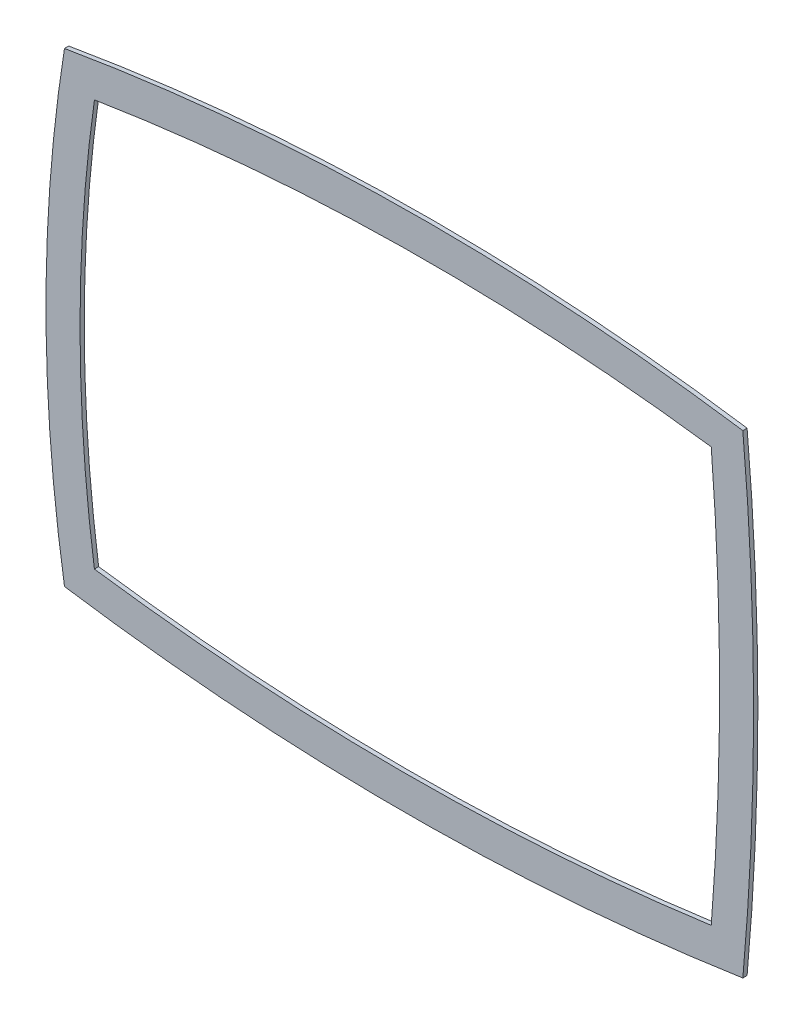
ISO-10303-21;
HEADER;
FILE_DESCRIPTION(('STEP AP214'),'2;1');
FILE_NAME('part.step','',(''),(''),'','','');
FILE_SCHEMA(('AUTOMOTIVE_DESIGN { 1 0 10303 214 1 1 1 1 }'));
ENDSEC;
DATA;
#1=APPLICATION_CONTEXT('core data for automotive mechanical design processes');
#2=APPLICATION_PROTOCOL_DEFINITION('international standard','automotive_design',2000,#1);
#3=PRODUCT_CONTEXT('',#1,'mechanical');
#4=PRODUCT('Part','Part','',(#3));
#5=PRODUCT_RELATED_PRODUCT_CATEGORY('part','',(#4));
#6=PRODUCT_DEFINITION_FORMATION('','',#4);
#7=PRODUCT_DEFINITION_CONTEXT('part definition',#1,'design');
#8=PRODUCT_DEFINITION('design','',#6,#7);
#9=PRODUCT_DEFINITION_SHAPE('','',#8);
#10=(LENGTH_UNIT() NAMED_UNIT(*) SI_UNIT(.MILLI.,.METRE.));
#11=(NAMED_UNIT(*) PLANE_ANGLE_UNIT() SI_UNIT($,.RADIAN.));
#12=(NAMED_UNIT(*) SI_UNIT($,.STERADIAN.) SOLID_ANGLE_UNIT());
#13=UNCERTAINTY_MEASURE_WITH_UNIT(LENGTH_MEASURE(1.E-05),#10,'distance_accuracy_value','');
#14=(GEOMETRIC_REPRESENTATION_CONTEXT(3) GLOBAL_UNCERTAINTY_ASSIGNED_CONTEXT((#13)) GLOBAL_UNIT_ASSIGNED_CONTEXT((#10,
#11,#12)) REPRESENTATION_CONTEXT('',''));
#15=CARTESIAN_POINT('',(0.,0.,0.));
#16=DIRECTION('',(0.,0.,1.));
#17=DIRECTION('',(1.,0.,0.));
#18=AXIS2_PLACEMENT_3D('',#15,#16,#17);
#19=CARTESIAN_POINT('',(0.,0.,0.05));
#20=DIRECTION('',(0.,0.,1.));
#21=DIRECTION('',(1.,0.,0.));
#22=AXIS2_PLACEMENT_3D('',#19,#20,#21);
#23=PLANE('',#22);
#24=CARTESIAN_POINT('',(13.32185390553,-0.08280400000007,0.05));
#25=DIRECTION('',(0.,0.,1.));
#26=DIRECTION('',(1.,0.,0.));
#27=AXIS2_PLACEMENT_3D('',#24,#25,#26);
#28=CIRCLE('',#27,16.93185738939);
#29=CARTESIAN_POINT('',(-3.44100462593836,-2.46909159972882,0.05));
#30=VERTEX_POINT('',#29);
#31=CARTESIAN_POINT('',(-3.44057604419055,2.30649230547407,0.05));
#32=VERTEX_POINT('',#31);
#33=EDGE_CURVE('E122',#30,#32,#28,.F.);
#34=ORIENTED_EDGE('',*,*,#33,.T.);
#35=CARTESIAN_POINT('',(0.4963395653323,-22.22472622658,0.05));
#36=DIRECTION('',(0.,0.,1.));
#37=DIRECTION('',(1.,0.,0.));
#38=AXIS2_PLACEMENT_3D('',#35,#36,#37);
#39=CIRCLE('',#38,24.84511998731);
#40=CARTESIAN_POINT('',(3.80738102384557,2.3987786345061,0.05));
#41=VERTEX_POINT('',#40);
#42=EDGE_CURVE('E131',#32,#41,#39,.F.);
#43=ORIENTED_EDGE('',*,*,#42,.T.);
#44=CARTESIAN_POINT('',(-26.39544361111,-0.03530600000002,0.05));
#45=DIRECTION('',(0.,0.,1.));
#46=DIRECTION('',(1.,0.,0.));
#47=AXIS2_PLACEMENT_3D('',#44,#45,#46);
#48=CIRCLE('',#47,30.30074890061);
#49=CARTESIAN_POINT('',(3.8073200234401,-2.47014742672833,0.05));
#50=VERTEX_POINT('',#49);
#51=EDGE_CURVE('E128',#41,#50,#48,.F.);
#52=ORIENTED_EDGE('',*,*,#51,.T.);
#53=CARTESIAN_POINT('',(0.186944,23.52359783707,0.05));
#54=DIRECTION('',(0.,0.,1.));
#55=DIRECTION('',(1.,0.,0.));
#56=AXIS2_PLACEMENT_3D('',#53,#54,#55);
#57=CIRCLE('',#56,26.24465498707);
#58=EDGE_CURVE('E125',#50,#30,#57,.F.);
#59=ORIENTED_EDGE('',*,*,#58,.T.);
#60=EDGE_LOOP('',(#34,#43,#52,#59));
#61=FACE_BOUND('',#60,.T.);
#62=CARTESIAN_POINT('',(0.4963395653323,-22.22472622658,0.05));
#63=DIRECTION('',(0.,0.,1.));
#64=DIRECTION('',(1.,0.,0.));
#65=AXIS2_PLACEMENT_3D('',#62,#63,#64);
#66=CIRCLE('',#65,25.24511998731);
#67=CARTESIAN_POINT('',(-3.79265843341391,2.65338823855642,0.05));
#68=VERTEX_POINT('',#67);
#69=CARTESIAN_POINT('',(4.17866083539406,2.75039325737302,0.05));
#70=VERTEX_POINT('',#69);
#71=EDGE_CURVE('E91',#68,#70,#66,.F.);
#72=ORIENTED_EDGE('',*,*,#71,.F.);
#73=CARTESIAN_POINT('',(13.32185390553,-0.08280400000005,0.05));
#74=DIRECTION('',(0.,0.,1.));
#75=DIRECTION('',(1.,0.,0.));
#76=AXIS2_PLACEMENT_3D('',#73,#74,#75);
#77=CIRCLE('',#76,17.33185738939);
#78=CARTESIAN_POINT('',(-3.79213527868488,-2.82226649633031,0.05));
#79=VERTEX_POINT('',#78);
#80=EDGE_CURVE('E20',#79,#68,#77,.F.);
#81=ORIENTED_EDGE('',*,*,#80,.F.);
#82=CARTESIAN_POINT('',(0.186944,23.52359783707,0.05));
#83=DIRECTION('',(0.,0.,1.));
#84=DIRECTION('',(1.,0.,0.));
#85=AXIS2_PLACEMENT_3D('',#82,#83,#84);
#86=CIRCLE('',#85,26.64465498707);
#87=CARTESIAN_POINT('',(4.17872093073663,-2.82034560948397,0.05));
#88=VERTEX_POINT('',#87);
#89=EDGE_CURVE('E79',#88,#79,#86,.F.);
#90=ORIENTED_EDGE('',*,*,#89,.F.);
#91=CARTESIAN_POINT('',(-26.39544361111,-0.03530599999999,0.05));
#92=DIRECTION('',(0.,0.,1.));
#93=DIRECTION('',(1.,0.,0.));
#94=AXIS2_PLACEMENT_3D('',#91,#92,#93);
#95=CIRCLE('',#94,30.70074890061);
#96=EDGE_CURVE('E98',#70,#88,#95,.F.);
#97=ORIENTED_EDGE('',*,*,#96,.F.);
#98=EDGE_LOOP('',(#72,#81,#90,#97));
#99=FACE_BOUND('',#98,.T.);
#100=ADVANCED_FACE('F17',(#61,#99),#23,.T.);
#101=CARTESIAN_POINT('',(13.32185390553,-0.08280400000005,0.));
#102=DIRECTION('',(0.,0.,1.));
#103=DIRECTION('',(1.,0.,0.));
#104=AXIS2_PLACEMENT_3D('',#101,#102,#103);
#105=CYLINDRICAL_SURFACE('',#104,17.33185738939);
#106=DIRECTION('',(0.,0.,1.));
#107=VECTOR('',#106,1.);
#108=CARTESIAN_POINT('',(-3.79265843341534,2.65338823855617,0.));
#109=LINE('',#108,#107);
#110=CARTESIAN_POINT('',(-3.79265843341391,2.65338823855642,0.));
#111=VERTEX_POINT('',#110);
#112=EDGE_CURVE('E134',#111,#68,#109,.T.);
#113=ORIENTED_EDGE('',*,*,#112,.F.);
#114=CARTESIAN_POINT('',(13.32185390553,-0.08280400000005,0.));
#115=DIRECTION('',(0.,0.,1.));
#116=DIRECTION('',(1.,0.,0.));
#117=AXIS2_PLACEMENT_3D('',#114,#115,#116);
#118=CIRCLE('',#117,17.33185738939);
#119=CARTESIAN_POINT('',(-3.79213527868488,-2.82226649633031,0.));
#120=VERTEX_POINT('',#119);
#121=EDGE_CURVE('E97',#111,#120,#118,.T.);
#122=ORIENTED_EDGE('',*,*,#121,.T.);
#123=DIRECTION('',(0.,0.,1.));
#124=VECTOR('',#123,1.);
#125=CARTESIAN_POINT('',(-3.79213527868701,-2.82226649632999,0.));
#126=LINE('',#125,#124);
#127=EDGE_CURVE('E84',#79,#120,#126,.F.);
#128=ORIENTED_EDGE('',*,*,#127,.F.);
#129=ORIENTED_EDGE('',*,*,#80,.T.);
#130=EDGE_LOOP('',(#113,#122,#128,#129));
#131=FACE_BOUND('',#130,.T.);
#132=ADVANCED_FACE('F96',(#131),#105,.T.);
#133=CARTESIAN_POINT('',(0.186944,23.52359783707,0.));
#134=DIRECTION('',(0.,0.,1.));
#135=DIRECTION('',(1.,0.,0.));
#136=AXIS2_PLACEMENT_3D('',#133,#134,#135);
#137=CYLINDRICAL_SURFACE('',#136,26.64465498707);
#138=ORIENTED_EDGE('',*,*,#127,.T.);
#139=CARTESIAN_POINT('',(0.186944,23.52359783707,0.));
#140=DIRECTION('',(0.,0.,1.));
#141=DIRECTION('',(1.,0.,0.));
#142=AXIS2_PLACEMENT_3D('',#139,#140,#141);
#143=CIRCLE('',#142,26.64465498707);
#144=CARTESIAN_POINT('',(4.17872093073663,-2.82034560948397,0.));
#145=VERTEX_POINT('',#144);
#146=EDGE_CURVE('E118',#120,#145,#143,.T.);
#147=ORIENTED_EDGE('',*,*,#146,.T.);
#148=DIRECTION('',(0.,0.,1.));
#149=VECTOR('',#148,1.);
#150=CARTESIAN_POINT('',(4.17872093073662,-2.82034560948398,0.));
#151=LINE('',#150,#149);
#152=EDGE_CURVE('E86',#88,#145,#151,.F.);
#153=ORIENTED_EDGE('',*,*,#152,.F.);
#154=ORIENTED_EDGE('',*,*,#89,.T.);
#155=EDGE_LOOP('',(#138,#147,#153,#154));
#156=FACE_BOUND('',#155,.T.);
#157=ADVANCED_FACE('F81',(#156),#137,.T.);
#158=CARTESIAN_POINT('',(-26.39544361111,-0.03530599999999,0.));
#159=DIRECTION('',(0.,0.,1.));
#160=DIRECTION('',(1.,0.,0.));
#161=AXIS2_PLACEMENT_3D('',#158,#159,#160);
#162=CYLINDRICAL_SURFACE('',#161,30.70074890061);
#163=ORIENTED_EDGE('',*,*,#152,.T.);
#164=CARTESIAN_POINT('',(-26.39544361111,-0.03530599999999,0.));
#165=DIRECTION('',(0.,0.,1.));
#166=DIRECTION('',(1.,0.,0.));
#167=AXIS2_PLACEMENT_3D('',#164,#165,#166);
#168=CIRCLE('',#167,30.70074890061);
#169=CARTESIAN_POINT('',(4.17866083539406,2.75039325737302,0.));
#170=VERTEX_POINT('',#169);
#171=EDGE_CURVE('E115',#145,#170,#168,.T.);
#172=ORIENTED_EDGE('',*,*,#171,.T.);
#173=DIRECTION('',(0.,0.,1.));
#174=VECTOR('',#173,1.);
#175=CARTESIAN_POINT('',(4.17866083539343,2.75039325737311,0.));
#176=LINE('',#175,#174);
#177=EDGE_CURVE('E133',#70,#170,#176,.F.);
#178=ORIENTED_EDGE('',*,*,#177,.F.);
#179=ORIENTED_EDGE('',*,*,#96,.T.);
#180=EDGE_LOOP('',(#163,#172,#178,#179));
#181=FACE_BOUND('',#180,.T.);
#182=ADVANCED_FACE('F181',(#181),#162,.T.);
#183=CARTESIAN_POINT('',(0.4963395653323,-22.22472622658,0.));
#184=DIRECTION('',(0.,0.,1.));
#185=DIRECTION('',(1.,0.,0.));
#186=AXIS2_PLACEMENT_3D('',#183,#184,#185);
#187=CYLINDRICAL_SURFACE('',#186,25.24511998731);
#188=ORIENTED_EDGE('',*,*,#177,.T.);
#189=CARTESIAN_POINT('',(0.4963395653323,-22.22472622658,0.));
#190=DIRECTION('',(0.,0.,1.));
#191=DIRECTION('',(1.,0.,0.));
#192=AXIS2_PLACEMENT_3D('',#189,#190,#191);
#193=CIRCLE('',#192,25.24511998731);
#194=EDGE_CURVE('E112',#170,#111,#193,.T.);
#195=ORIENTED_EDGE('',*,*,#194,.T.);
#196=ORIENTED_EDGE('',*,*,#112,.T.);
#197=ORIENTED_EDGE('',*,*,#71,.T.);
#198=EDGE_LOOP('',(#188,#195,#196,#197));
#199=FACE_BOUND('',#198,.T.);
#200=ADVANCED_FACE('F178',(#199),#187,.T.);
#201=CARTESIAN_POINT('',(0.4963395653323,-22.22472622658,0.));
#202=DIRECTION('',(0.,0.,1.));
#203=DIRECTION('',(1.,0.,0.));
#204=AXIS2_PLACEMENT_3D('',#201,#202,#203);
#205=CYLINDRICAL_SURFACE('',#204,24.84511998731);
#206=ORIENTED_EDGE('',*,*,#42,.F.);
#207=DIRECTION('',(0.,0.,1.));
#208=VECTOR('',#207,1.);
#209=CARTESIAN_POINT('',(-3.44057604419035,2.30649230547548,0.));
#210=LINE('',#209,#208);
#211=CARTESIAN_POINT('',(-3.44057604419055,2.30649230547407,0.));
#212=VERTEX_POINT('',#211);
#213=EDGE_CURVE('E121',#32,#212,#210,.F.);
#214=ORIENTED_EDGE('',*,*,#213,.T.);
#215=CARTESIAN_POINT('',(0.4963395653323,-22.22472622658,0.));
#216=DIRECTION('',(0.,0.,1.));
#217=DIRECTION('',(1.,0.,0.));
#218=AXIS2_PLACEMENT_3D('',#215,#216,#217);
#219=CIRCLE('',#218,24.84511998731);
#220=CARTESIAN_POINT('',(3.80738102384557,2.39877863450611,0.));
#221=VERTEX_POINT('',#220);
#222=EDGE_CURVE('E109',#212,#221,#219,.F.);
#223=ORIENTED_EDGE('',*,*,#222,.T.);
#224=DIRECTION('',(0.,0.,1.));
#225=VECTOR('',#224,1.);
#226=CARTESIAN_POINT('',(3.80738102384542,2.39877863450803,0.));
#227=LINE('',#226,#225);
#228=EDGE_CURVE('E130',#221,#41,#227,.T.);
#229=ORIENTED_EDGE('',*,*,#228,.T.);
#230=EDGE_LOOP('',(#206,#214,#223,#229));
#231=FACE_BOUND('',#230,.T.);
#232=ADVANCED_FACE('F146',(#231),#205,.F.);
#233=CARTESIAN_POINT('',(-26.39544361111,-0.03530600000002,0.));
#234=DIRECTION('',(0.,0.,1.));
#235=DIRECTION('',(1.,0.,0.));
#236=AXIS2_PLACEMENT_3D('',#233,#234,#235);
#237=CYLINDRICAL_SURFACE('',#236,30.30074890061);
#238=ORIENTED_EDGE('',*,*,#51,.F.);
#239=ORIENTED_EDGE('',*,*,#228,.F.);
#240=CARTESIAN_POINT('',(-26.39544361111,-0.03530600000002,0.));
#241=DIRECTION('',(0.,0.,1.));
#242=DIRECTION('',(1.,0.,0.));
#243=AXIS2_PLACEMENT_3D('',#240,#241,#242);
#244=CIRCLE('',#243,30.30074890061);
#245=CARTESIAN_POINT('',(3.8073200234401,-2.47014742672833,0.));
#246=VERTEX_POINT('',#245);
#247=EDGE_CURVE('E106',#221,#246,#244,.F.);
#248=ORIENTED_EDGE('',*,*,#247,.T.);
#249=DIRECTION('',(0.,0.,1.));
#250=VECTOR('',#249,1.);
#251=CARTESIAN_POINT('',(3.80732002344004,-2.47014742672834,0.));
#252=LINE('',#251,#250);
#253=EDGE_CURVE('E127',#246,#50,#252,.T.);
#254=ORIENTED_EDGE('',*,*,#253,.T.);
#255=EDGE_LOOP('',(#238,#239,#248,#254));
#256=FACE_BOUND('',#255,.T.);
#257=ADVANCED_FACE('F158',(#256),#237,.F.);
#258=CARTESIAN_POINT('',(0.186944,23.52359783707,0.));
#259=DIRECTION('',(0.,0.,1.));
#260=DIRECTION('',(1.,0.,0.));
#261=AXIS2_PLACEMENT_3D('',#258,#259,#260);
#262=CYLINDRICAL_SURFACE('',#261,26.24465498707);
#263=ORIENTED_EDGE('',*,*,#58,.F.);
#264=ORIENTED_EDGE('',*,*,#253,.F.);
#265=CARTESIAN_POINT('',(0.186944,23.52359783707,0.));
#266=DIRECTION('',(0.,0.,1.));
#267=DIRECTION('',(1.,0.,0.));
#268=AXIS2_PLACEMENT_3D('',#265,#266,#267);
#269=CIRCLE('',#268,26.24465498707);
#270=CARTESIAN_POINT('',(-3.44100462593836,-2.46909159972882,0.));
#271=VERTEX_POINT('',#270);
#272=EDGE_CURVE('E26',#246,#271,#269,.F.);
#273=ORIENTED_EDGE('',*,*,#272,.T.);
#274=DIRECTION('',(0.,0.,1.));
#275=VECTOR('',#274,1.);
#276=CARTESIAN_POINT('',(-3.44100462593841,-2.46909159972848,0.));
#277=LINE('',#276,#275);
#278=EDGE_CURVE('E34',#271,#30,#277,.T.);
#279=ORIENTED_EDGE('',*,*,#278,.T.);
#280=EDGE_LOOP('',(#263,#264,#273,#279));
#281=FACE_BOUND('',#280,.T.);
#282=ADVANCED_FACE('F155',(#281),#262,.F.);
#283=CARTESIAN_POINT('',(13.32185390553,-0.08280400000007,0.));
#284=DIRECTION('',(0.,0.,1.));
#285=DIRECTION('',(1.,0.,0.));
#286=AXIS2_PLACEMENT_3D('',#283,#284,#285);
#287=CYLINDRICAL_SURFACE('',#286,16.93185738939);
#288=ORIENTED_EDGE('',*,*,#33,.F.);
#289=ORIENTED_EDGE('',*,*,#278,.F.);
#290=CARTESIAN_POINT('',(13.32185390553,-0.08280400000007,0.));
#291=DIRECTION('',(0.,0.,1.));
#292=DIRECTION('',(1.,0.,0.));
#293=AXIS2_PLACEMENT_3D('',#290,#291,#292);
#294=CIRCLE('',#293,16.93185738939);
#295=EDGE_CURVE('E11',#271,#212,#294,.F.);
#296=ORIENTED_EDGE('',*,*,#295,.T.);
#297=ORIENTED_EDGE('',*,*,#213,.F.);
#298=EDGE_LOOP('',(#288,#289,#296,#297));
#299=FACE_BOUND('',#298,.T.);
#300=ADVANCED_FACE('F147',(#299),#287,.F.);
#301=CARTESIAN_POINT('',(0.,0.,0.));
#302=DIRECTION('',(0.,0.,1.));
#303=DIRECTION('',(1.,0.,0.));
#304=AXIS2_PLACEMENT_3D('',#301,#302,#303);
#305=PLANE('',#304);
#306=ORIENTED_EDGE('',*,*,#272,.F.);
#307=ORIENTED_EDGE('',*,*,#247,.F.);
#308=ORIENTED_EDGE('',*,*,#222,.F.);
#309=ORIENTED_EDGE('',*,*,#295,.F.);
#310=EDGE_LOOP('',(#306,#307,#308,#309));
#311=FACE_BOUND('',#310,.T.);
#312=ORIENTED_EDGE('',*,*,#171,.F.);
#313=ORIENTED_EDGE('',*,*,#146,.F.);
#314=ORIENTED_EDGE('',*,*,#121,.F.);
#315=ORIENTED_EDGE('',*,*,#194,.F.);
#316=EDGE_LOOP('',(#312,#313,#314,#315));
#317=FACE_BOUND('',#316,.T.);
#318=ADVANCED_FACE('F150',(#311,#317),#305,.F.);
#319=CLOSED_SHELL('',(#100,#132,#157,#182,#200,#232,#257,#282,#300,#318));
#320=MANIFOLD_SOLID_BREP('B1',#319);
#321=ADVANCED_BREP_SHAPE_REPRESENTATION('',(#18,#320),#14);
#322=SHAPE_DEFINITION_REPRESENTATION(#9,#321);
ENDSEC;
END-ISO-10303-21;
